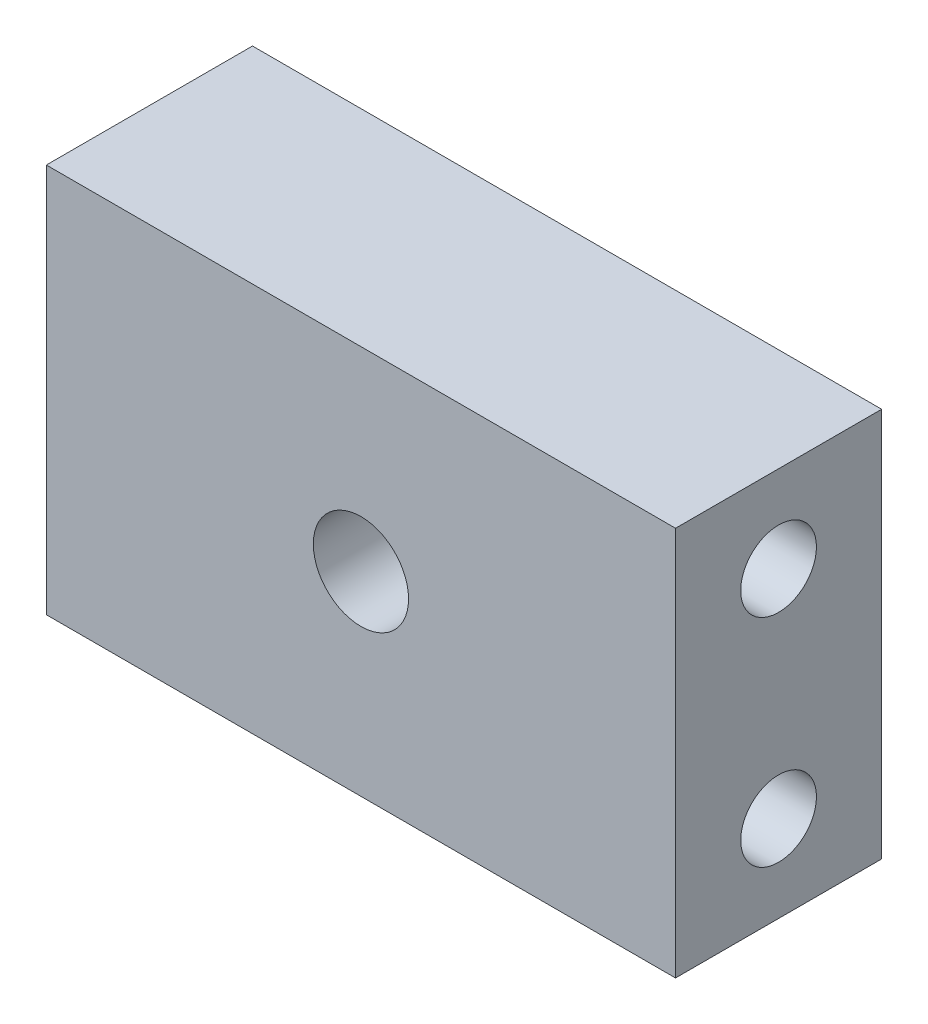
ISO-10303-21;
HEADER;
FILE_DESCRIPTION(('STEP AP214'),'2;1');
FILE_NAME('part.step','',(''),(''),'','','');
FILE_SCHEMA(('AUTOMOTIVE_DESIGN { 1 0 10303 214 1 1 1 1 }'));
ENDSEC;
DATA;
#1=APPLICATION_CONTEXT('core data for automotive mechanical design processes');
#2=APPLICATION_PROTOCOL_DEFINITION('international standard','automotive_design',2000,#1);
#3=PRODUCT_CONTEXT('',#1,'mechanical');
#4=PRODUCT('Part','Part','',(#3));
#5=PRODUCT_RELATED_PRODUCT_CATEGORY('part','',(#4));
#6=PRODUCT_DEFINITION_FORMATION('','',#4);
#7=PRODUCT_DEFINITION_CONTEXT('part definition',#1,'design');
#8=PRODUCT_DEFINITION('design','',#6,#7);
#9=PRODUCT_DEFINITION_SHAPE('','',#8);
#10=(LENGTH_UNIT() NAMED_UNIT(*) SI_UNIT(.MILLI.,.METRE.));
#11=(NAMED_UNIT(*) PLANE_ANGLE_UNIT() SI_UNIT($,.RADIAN.));
#12=(NAMED_UNIT(*) SI_UNIT($,.STERADIAN.) SOLID_ANGLE_UNIT());
#13=UNCERTAINTY_MEASURE_WITH_UNIT(LENGTH_MEASURE(1.E-05),#10,'distance_accuracy_value','');
#14=(GEOMETRIC_REPRESENTATION_CONTEXT(3) GLOBAL_UNCERTAINTY_ASSIGNED_CONTEXT((#13)) GLOBAL_UNIT_ASSIGNED_CONTEXT((#10,
#11,#12)) REPRESENTATION_CONTEXT('',''));
#15=CARTESIAN_POINT('',(0.,0.,0.));
#16=DIRECTION('',(0.,0.,1.));
#17=DIRECTION('',(1.,0.,0.));
#18=AXIS2_PLACEMENT_3D('',#15,#16,#17);
#19=CARTESIAN_POINT('',(14.5375,9.,9.525));
#20=DIRECTION('',(-1.,0.,0.));
#21=DIRECTION('',(0.,0.,1.));
#22=AXIS2_PLACEMENT_3D('',#19,#20,#21);
#23=PLANE('',#22);
#24=CARTESIAN_POINT('',(14.5375,-5.,4.76249999999999));
#25=DIRECTION('',(1.,0.,0.));
#26=DIRECTION('',(0.,0.,-1.));
#27=AXIS2_PLACEMENT_3D('',#24,#25,#26);
#28=CIRCLE('',#27,1.75);
#29=CARTESIAN_POINT('',(14.5375,-5.,3.0125));
#30=VERTEX_POINT('',#29);
#31=EDGE_CURVE('E129',#30,#30,#28,.T.);
#32=ORIENTED_EDGE('',*,*,#31,.F.);
#33=EDGE_LOOP('',(#32));
#34=FACE_BOUND('',#33,.T.);
#35=CARTESIAN_POINT('',(14.5375,5.,4.7625));
#36=DIRECTION('',(1.,0.,0.));
#37=DIRECTION('',(0.,0.,-1.));
#38=AXIS2_PLACEMENT_3D('',#35,#36,#37);
#39=CIRCLE('',#38,1.75);
#40=CARTESIAN_POINT('',(14.5375,5.,3.0125));
#41=VERTEX_POINT('',#40);
#42=EDGE_CURVE('E122',#41,#41,#39,.T.);
#43=ORIENTED_EDGE('',*,*,#42,.F.);
#44=EDGE_LOOP('',(#43));
#45=FACE_BOUND('',#44,.T.);
#46=DIRECTION('',(0.,1.,0.));
#47=VECTOR('',#46,1.);
#48=CARTESIAN_POINT('',(14.5375,9.,0.));
#49=LINE('',#48,#47);
#50=CARTESIAN_POINT('',(14.5375,-9.,0.));
#51=VERTEX_POINT('',#50);
#52=CARTESIAN_POINT('',(14.5375,9.,0.));
#53=VERTEX_POINT('',#52);
#54=EDGE_CURVE('E96',#51,#53,#49,.T.);
#55=ORIENTED_EDGE('',*,*,#54,.T.);
#56=DIRECTION('',(0.,0.,-1.));
#57=VECTOR('',#56,1.);
#58=CARTESIAN_POINT('',(14.5375,9.,9.525));
#59=LINE('',#58,#57);
#60=CARTESIAN_POINT('',(14.5375,9.,9.525));
#61=VERTEX_POINT('',#60);
#62=EDGE_CURVE('E11',#61,#53,#59,.T.);
#63=ORIENTED_EDGE('',*,*,#62,.F.);
#64=DIRECTION('',(0.,1.,0.));
#65=VECTOR('',#64,1.);
#66=CARTESIAN_POINT('',(14.5375,9.,9.525));
#67=LINE('',#66,#65);
#68=CARTESIAN_POINT('',(14.5375,-9.,9.525));
#69=VERTEX_POINT('',#68);
#70=EDGE_CURVE('E84',#69,#61,#67,.T.);
#71=ORIENTED_EDGE('',*,*,#70,.F.);
#72=DIRECTION('',(0.,0.,-1.));
#73=VECTOR('',#72,1.);
#74=CARTESIAN_POINT('',(14.5375,-9.,9.525));
#75=LINE('',#74,#73);
#76=EDGE_CURVE('E92',#69,#51,#75,.T.);
#77=ORIENTED_EDGE('',*,*,#76,.T.);
#78=EDGE_LOOP('',(#55,#63,#71,#77));
#79=FACE_BOUND('',#78,.T.);
#80=ADVANCED_FACE('F33',(#34,#45,#79),#23,.F.);
#81=CARTESIAN_POINT('',(-14.5375,9.,9.525));
#82=DIRECTION('',(0.,-1.,0.));
#83=DIRECTION('',(0.,0.,-1.));
#84=AXIS2_PLACEMENT_3D('',#81,#82,#83);
#85=PLANE('',#84);
#86=DIRECTION('',(-1.,0.,0.));
#87=VECTOR('',#86,1.);
#88=CARTESIAN_POINT('',(-14.5375,9.,0.));
#89=LINE('',#88,#87);
#90=CARTESIAN_POINT('',(-14.5375,9.,0.));
#91=VERTEX_POINT('',#90);
#92=EDGE_CURVE('E88',#53,#91,#89,.T.);
#93=ORIENTED_EDGE('',*,*,#92,.T.);
#94=DIRECTION('',(0.,0.,-1.));
#95=VECTOR('',#94,1.);
#96=CARTESIAN_POINT('',(-14.5375,9.,9.525));
#97=LINE('',#96,#95);
#98=CARTESIAN_POINT('',(-14.5375,9.,9.525));
#99=VERTEX_POINT('',#98);
#100=EDGE_CURVE('E41',#99,#91,#97,.T.);
#101=ORIENTED_EDGE('',*,*,#100,.F.);
#102=DIRECTION('',(-1.,0.,0.));
#103=VECTOR('',#102,1.);
#104=CARTESIAN_POINT('',(-14.5375,9.,9.525));
#105=LINE('',#104,#103);
#106=EDGE_CURVE('E79',#61,#99,#105,.T.);
#107=ORIENTED_EDGE('',*,*,#106,.F.);
#108=ORIENTED_EDGE('',*,*,#62,.T.);
#109=EDGE_LOOP('',(#93,#101,#107,#108));
#110=FACE_BOUND('',#109,.T.);
#111=ADVANCED_FACE('F87',(#110),#85,.F.);
#112=CARTESIAN_POINT('',(-14.5375,9.,9.525));
#113=DIRECTION('',(1.,0.,0.));
#114=DIRECTION('',(0.,0.,-1.));
#115=AXIS2_PLACEMENT_3D('',#112,#113,#114);
#116=PLANE('',#115);
#117=CARTESIAN_POINT('',(-14.5375,5.,4.7625));
#118=DIRECTION('',(-1.,0.,0.));
#119=DIRECTION('',(0.,0.,1.));
#120=AXIS2_PLACEMENT_3D('',#117,#118,#119);
#121=CIRCLE('',#120,1.75);
#122=CARTESIAN_POINT('',(-14.5375,5.,6.5125));
#123=VERTEX_POINT('',#122);
#124=EDGE_CURVE('E117',#123,#123,#121,.T.);
#125=ORIENTED_EDGE('',*,*,#124,.F.);
#126=EDGE_LOOP('',(#125));
#127=FACE_BOUND('',#126,.T.);
#128=CARTESIAN_POINT('',(-14.5375,-5.,4.76249999999999));
#129=DIRECTION('',(-1.,0.,0.));
#130=DIRECTION('',(0.,0.,-1.));
#131=AXIS2_PLACEMENT_3D('',#128,#129,#130);
#132=CIRCLE('',#131,1.75);
#133=CARTESIAN_POINT('',(-14.5375,-5.,3.0125));
#134=VERTEX_POINT('',#133);
#135=EDGE_CURVE('E110',#134,#134,#132,.T.);
#136=ORIENTED_EDGE('',*,*,#135,.F.);
#137=EDGE_LOOP('',(#136));
#138=FACE_BOUND('',#137,.T.);
#139=DIRECTION('',(0.,-1.,0.));
#140=VECTOR('',#139,1.);
#141=CARTESIAN_POINT('',(-14.5375,9.,0.));
#142=LINE('',#141,#140);
#143=CARTESIAN_POINT('',(-14.5375,-9.,0.));
#144=VERTEX_POINT('',#143);
#145=EDGE_CURVE('E66',#91,#144,#142,.T.);
#146=ORIENTED_EDGE('',*,*,#145,.T.);
#147=DIRECTION('',(0.,0.,-1.));
#148=VECTOR('',#147,1.);
#149=CARTESIAN_POINT('',(-14.5375,-9.,9.525));
#150=LINE('',#149,#148);
#151=CARTESIAN_POINT('',(-14.5375,-9.,9.525));
#152=VERTEX_POINT('',#151);
#153=EDGE_CURVE('E89',#152,#144,#150,.T.);
#154=ORIENTED_EDGE('',*,*,#153,.F.);
#155=DIRECTION('',(0.,-1.,0.));
#156=VECTOR('',#155,1.);
#157=CARTESIAN_POINT('',(-14.5375,9.,9.525));
#158=LINE('',#157,#156);
#159=EDGE_CURVE('E82',#99,#152,#158,.T.);
#160=ORIENTED_EDGE('',*,*,#159,.F.);
#161=ORIENTED_EDGE('',*,*,#100,.T.);
#162=EDGE_LOOP('',(#146,#154,#160,#161));
#163=FACE_BOUND('',#162,.T.);
#164=ADVANCED_FACE('F90',(#127,#138,#163),#116,.F.);
#165=CARTESIAN_POINT('',(-14.5375,-9.,9.525));
#166=DIRECTION('',(0.,1.,0.));
#167=DIRECTION('',(0.,0.,1.));
#168=AXIS2_PLACEMENT_3D('',#165,#166,#167);
#169=PLANE('',#168);
#170=DIRECTION('',(1.,0.,0.));
#171=VECTOR('',#170,1.);
#172=CARTESIAN_POINT('',(-14.5375,-9.,0.));
#173=LINE('',#172,#171);
#174=EDGE_CURVE('E72',#144,#51,#173,.T.);
#175=ORIENTED_EDGE('',*,*,#174,.T.);
#176=ORIENTED_EDGE('',*,*,#76,.F.);
#177=DIRECTION('',(1.,0.,0.));
#178=VECTOR('',#177,1.);
#179=CARTESIAN_POINT('',(-14.5375,-9.,9.525));
#180=LINE('',#179,#178);
#181=EDGE_CURVE('E49',#152,#69,#180,.T.);
#182=ORIENTED_EDGE('',*,*,#181,.F.);
#183=ORIENTED_EDGE('',*,*,#153,.T.);
#184=EDGE_LOOP('',(#175,#176,#182,#183));
#185=FACE_BOUND('',#184,.T.);
#186=ADVANCED_FACE('F104',(#185),#169,.F.);
#187=CARTESIAN_POINT('',(0.,0.,9.525));
#188=DIRECTION('',(0.,0.,1.));
#189=DIRECTION('',(1.,0.,0.));
#190=AXIS2_PLACEMENT_3D('',#187,#188,#189);
#191=PLANE('',#190);
#192=CARTESIAN_POINT('',(0.,0.,9.525));
#193=DIRECTION('',(0.,0.,1.));
#194=DIRECTION('',(1.,0.,0.));
#195=AXIS2_PLACEMENT_3D('',#192,#193,#194);
#196=CIRCLE('',#195,2.2);
#197=CARTESIAN_POINT('',(2.2,0.,9.525));
#198=VERTEX_POINT('',#197);
#199=EDGE_CURVE('E126',#198,#198,#196,.F.);
#200=ORIENTED_EDGE('',*,*,#199,.T.);
#201=EDGE_LOOP('',(#200));
#202=FACE_BOUND('',#201,.T.);
#203=ORIENTED_EDGE('',*,*,#70,.T.);
#204=ORIENTED_EDGE('',*,*,#106,.T.);
#205=ORIENTED_EDGE('',*,*,#159,.T.);
#206=ORIENTED_EDGE('',*,*,#181,.T.);
#207=EDGE_LOOP('',(#203,#204,#205,#206));
#208=FACE_BOUND('',#207,.T.);
#209=ADVANCED_FACE('F80',(#202,#208),#191,.T.);
#210=CARTESIAN_POINT('',(0.,0.,0.));
#211=DIRECTION('',(0.,0.,1.));
#212=DIRECTION('',(1.,0.,0.));
#213=AXIS2_PLACEMENT_3D('',#210,#211,#212);
#214=PLANE('',#213);
#215=CARTESIAN_POINT('',(0.,0.,0.));
#216=DIRECTION('',(0.,0.,-1.));
#217=DIRECTION('',(-1.,0.,0.));
#218=AXIS2_PLACEMENT_3D('',#215,#216,#217);
#219=CIRCLE('',#218,2.2);
#220=CARTESIAN_POINT('',(-2.2,0.,0.));
#221=VERTEX_POINT('',#220);
#222=EDGE_CURVE('E136',#221,#221,#219,.T.);
#223=ORIENTED_EDGE('',*,*,#222,.F.);
#224=EDGE_LOOP('',(#223));
#225=FACE_BOUND('',#224,.T.);
#226=ORIENTED_EDGE('',*,*,#54,.F.);
#227=ORIENTED_EDGE('',*,*,#174,.F.);
#228=ORIENTED_EDGE('',*,*,#145,.F.);
#229=ORIENTED_EDGE('',*,*,#92,.F.);
#230=EDGE_LOOP('',(#226,#227,#228,#229));
#231=FACE_BOUND('',#230,.T.);
#232=ADVANCED_FACE('F107',(#225,#231),#214,.F.);
#233=CARTESIAN_POINT('',(-6.5375,-5.,4.76249999999999));
#234=DIRECTION('',(-1.,0.,0.));
#235=DIRECTION('',(0.,0.,1.));
#236=AXIS2_PLACEMENT_3D('',#233,#234,#235);
#237=CYLINDRICAL_SURFACE('',#236,1.75);
#238=CARTESIAN_POINT('',(-6.5375,-5.,4.76249999999999));
#239=DIRECTION('',(-1.,0.,0.));
#240=DIRECTION('',(0.,0.,-1.));
#241=AXIS2_PLACEMENT_3D('',#238,#239,#240);
#242=CIRCLE('',#241,1.75);
#243=CARTESIAN_POINT('',(-6.5375,-5.,3.0125));
#244=VERTEX_POINT('',#243);
#245=EDGE_CURVE('E113',#244,#244,#242,.T.);
#246=ORIENTED_EDGE('',*,*,#245,.F.);
#247=EDGE_LOOP('',(#246));
#248=FACE_BOUND('',#247,.T.);
#249=ORIENTED_EDGE('',*,*,#135,.T.);
#250=EDGE_LOOP('',(#249));
#251=FACE_BOUND('',#250,.T.);
#252=ADVANCED_FACE('F144',(#248,#251),#237,.F.);
#253=CARTESIAN_POINT('',(-6.5375,-5.,4.76249999999999));
#254=DIRECTION('',(1.,0.,0.));
#255=DIRECTION('',(0.,0.,-1.));
#256=AXIS2_PLACEMENT_3D('',#253,#254,#255);
#257=PLANE('',#256);
#258=ORIENTED_EDGE('',*,*,#245,.T.);
#259=EDGE_LOOP('',(#258));
#260=FACE_BOUND('',#259,.T.);
#261=ADVANCED_FACE('F150',(#260),#257,.F.);
#262=CARTESIAN_POINT('',(-6.5375,5.,4.7625));
#263=DIRECTION('',(-1.,0.,0.));
#264=DIRECTION('',(0.,0.,1.));
#265=AXIS2_PLACEMENT_3D('',#262,#263,#264);
#266=CYLINDRICAL_SURFACE('',#265,1.75);
#267=CARTESIAN_POINT('',(-6.5375,5.,4.7625));
#268=DIRECTION('',(-1.,0.,0.));
#269=DIRECTION('',(0.,0.,1.));
#270=AXIS2_PLACEMENT_3D('',#267,#268,#269);
#271=CIRCLE('',#270,1.75);
#272=CARTESIAN_POINT('',(-6.5375,5.,6.5125));
#273=VERTEX_POINT('',#272);
#274=EDGE_CURVE('E99',#273,#273,#271,.T.);
#275=ORIENTED_EDGE('',*,*,#274,.F.);
#276=EDGE_LOOP('',(#275));
#277=FACE_BOUND('',#276,.T.);
#278=ORIENTED_EDGE('',*,*,#124,.T.);
#279=EDGE_LOOP('',(#278));
#280=FACE_BOUND('',#279,.T.);
#281=ADVANCED_FACE('F178',(#277,#280),#266,.F.);
#282=CARTESIAN_POINT('',(-6.5375,5.,4.7625));
#283=DIRECTION('',(-1.,0.,0.));
#284=DIRECTION('',(0.,0.,1.));
#285=AXIS2_PLACEMENT_3D('',#282,#283,#284);
#286=PLANE('',#285);
#287=ORIENTED_EDGE('',*,*,#274,.T.);
#288=EDGE_LOOP('',(#287));
#289=FACE_BOUND('',#288,.T.);
#290=ADVANCED_FACE('F168',(#289),#286,.T.);
#291=CARTESIAN_POINT('',(6.5375,5.,4.7625));
#292=DIRECTION('',(1.,0.,0.));
#293=DIRECTION('',(0.,0.,-1.));
#294=AXIS2_PLACEMENT_3D('',#291,#292,#293);
#295=CYLINDRICAL_SURFACE('',#294,1.75);
#296=CARTESIAN_POINT('',(6.5375,5.,4.7625));
#297=DIRECTION('',(1.,0.,0.));
#298=DIRECTION('',(0.,0.,-1.));
#299=AXIS2_PLACEMENT_3D('',#296,#297,#298);
#300=CIRCLE('',#299,1.75);
#301=CARTESIAN_POINT('',(6.5375,5.,3.0125));
#302=VERTEX_POINT('',#301);
#303=EDGE_CURVE('E125',#302,#302,#300,.T.);
#304=ORIENTED_EDGE('',*,*,#303,.F.);
#305=EDGE_LOOP('',(#304));
#306=FACE_BOUND('',#305,.T.);
#307=ORIENTED_EDGE('',*,*,#42,.T.);
#308=EDGE_LOOP('',(#307));
#309=FACE_BOUND('',#308,.T.);
#310=ADVANCED_FACE('F165',(#306,#309),#295,.F.);
#311=CARTESIAN_POINT('',(6.5375,5.,4.7625));
#312=DIRECTION('',(1.,0.,0.));
#313=DIRECTION('',(0.,0.,-1.));
#314=AXIS2_PLACEMENT_3D('',#311,#312,#313);
#315=PLANE('',#314);
#316=ORIENTED_EDGE('',*,*,#303,.T.);
#317=EDGE_LOOP('',(#316));
#318=FACE_BOUND('',#317,.T.);
#319=ADVANCED_FACE('F167',(#318),#315,.T.);
#320=CARTESIAN_POINT('',(6.5375,-5.,4.76249999999999));
#321=DIRECTION('',(1.,0.,0.));
#322=DIRECTION('',(0.,0.,-1.));
#323=AXIS2_PLACEMENT_3D('',#320,#321,#322);
#324=CYLINDRICAL_SURFACE('',#323,1.75);
#325=CARTESIAN_POINT('',(6.5375,-5.,4.76249999999999));
#326=DIRECTION('',(1.,0.,0.));
#327=DIRECTION('',(0.,0.,-1.));
#328=AXIS2_PLACEMENT_3D('',#325,#326,#327);
#329=CIRCLE('',#328,1.75);
#330=CARTESIAN_POINT('',(6.5375,-5.,3.0125));
#331=VERTEX_POINT('',#330);
#332=EDGE_CURVE('E114',#331,#331,#329,.T.);
#333=ORIENTED_EDGE('',*,*,#332,.F.);
#334=EDGE_LOOP('',(#333));
#335=FACE_BOUND('',#334,.T.);
#336=ORIENTED_EDGE('',*,*,#31,.T.);
#337=EDGE_LOOP('',(#336));
#338=FACE_BOUND('',#337,.T.);
#339=ADVANCED_FACE('F175',(#335,#338),#324,.F.);
#340=CARTESIAN_POINT('',(6.5375,-5.,4.76249999999999));
#341=DIRECTION('',(1.,0.,0.));
#342=DIRECTION('',(0.,0.,-1.));
#343=AXIS2_PLACEMENT_3D('',#340,#341,#342);
#344=PLANE('',#343);
#345=ORIENTED_EDGE('',*,*,#332,.T.);
#346=EDGE_LOOP('',(#345));
#347=FACE_BOUND('',#346,.T.);
#348=ADVANCED_FACE('F216',(#347),#344,.T.);
#349=CARTESIAN_POINT('',(0.,0.,15.7475396744416));
#350=DIRECTION('',(0.,0.,-1.));
#351=DIRECTION('',(-1.,0.,0.));
#352=AXIS2_PLACEMENT_3D('',#349,#350,#351);
#353=CYLINDRICAL_SURFACE('',#352,2.2);
#354=ORIENTED_EDGE('',*,*,#222,.T.);
#355=EDGE_LOOP('',(#354));
#356=FACE_BOUND('',#355,.T.);
#357=ORIENTED_EDGE('',*,*,#199,.F.);
#358=EDGE_LOOP('',(#357));
#359=FACE_BOUND('',#358,.T.);
#360=ADVANCED_FACE('F140',(#356,#359),#353,.F.);
#361=CLOSED_SHELL('',(#80,#111,#164,#186,#209,#232,#252,#261,#281,#290,#310,#319,#339,#348,#360));
#362=MANIFOLD_SOLID_BREP('B2',#361);
#363=ADVANCED_BREP_SHAPE_REPRESENTATION('',(#18,#362),#14);
#364=SHAPE_DEFINITION_REPRESENTATION(#9,#363);
ENDSEC;
END-ISO-10303-21;
